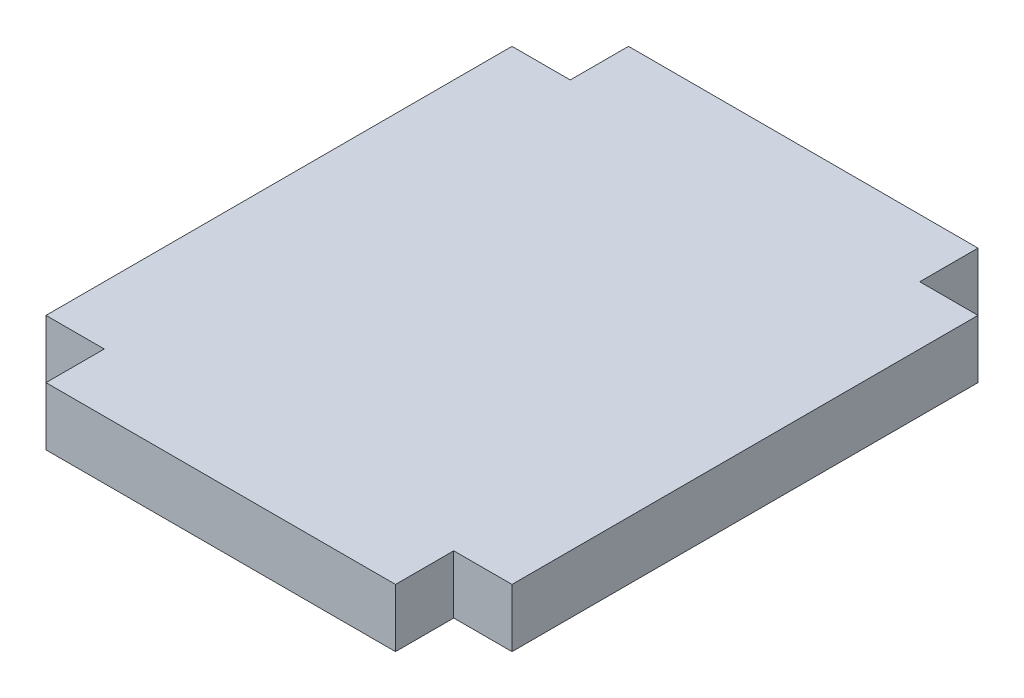
ISO-10303-21;
HEADER;
FILE_DESCRIPTION(('STEP AP214'),'2;1');
FILE_NAME('part.step','',(''),(''),'','','');
FILE_SCHEMA(('AUTOMOTIVE_DESIGN { 1 0 10303 214 1 1 1 1 }'));
ENDSEC;
DATA;
#1=APPLICATION_CONTEXT('core data for automotive mechanical design processes');
#2=APPLICATION_PROTOCOL_DEFINITION('international standard','automotive_design',2000,#1);
#3=PRODUCT_CONTEXT('',#1,'mechanical');
#4=PRODUCT('Part','Part','',(#3));
#5=PRODUCT_RELATED_PRODUCT_CATEGORY('part','',(#4));
#6=PRODUCT_DEFINITION_FORMATION('','',#4);
#7=PRODUCT_DEFINITION_CONTEXT('part definition',#1,'design');
#8=PRODUCT_DEFINITION('design','',#6,#7);
#9=PRODUCT_DEFINITION_SHAPE('','',#8);
#10=(LENGTH_UNIT() NAMED_UNIT(*) SI_UNIT(.MILLI.,.METRE.));
#11=(NAMED_UNIT(*) PLANE_ANGLE_UNIT() SI_UNIT($,.RADIAN.));
#12=(NAMED_UNIT(*) SI_UNIT($,.STERADIAN.) SOLID_ANGLE_UNIT());
#13=UNCERTAINTY_MEASURE_WITH_UNIT(LENGTH_MEASURE(1.E-05),#10,'distance_accuracy_value','');
#14=(GEOMETRIC_REPRESENTATION_CONTEXT(3) GLOBAL_UNCERTAINTY_ASSIGNED_CONTEXT((#13)) GLOBAL_UNIT_ASSIGNED_CONTEXT((#10,
#11,#12)) REPRESENTATION_CONTEXT('',''));
#15=CARTESIAN_POINT('',(0.,0.,0.));
#16=DIRECTION('',(0.,0.,1.));
#17=DIRECTION('',(1.,0.,0.));
#18=AXIS2_PLACEMENT_3D('',#15,#16,#17);
#19=CARTESIAN_POINT('',(0.,3.,-3.));
#20=DIRECTION('',(0.,0.,1.));
#21=DIRECTION('',(1.,0.,0.));
#22=AXIS2_PLACEMENT_3D('',#19,#20,#21);
#23=PLANE('',#22);
#24=DIRECTION('',(-1.,0.,0.));
#25=VECTOR('',#24,1.);
#26=CARTESIAN_POINT('',(0.,0.,-3.));
#27=LINE('',#26,#25);
#28=CARTESIAN_POINT('',(0.,0.,-3.));
#29=VERTEX_POINT('',#28);
#30=CARTESIAN_POINT('',(-3.,0.,-3.));
#31=VERTEX_POINT('',#30);
#32=EDGE_CURVE('E148',#29,#31,#27,.T.);
#33=ORIENTED_EDGE('',*,*,#32,.F.);
#34=DIRECTION('',(0.,-1.,0.));
#35=VECTOR('',#34,1.);
#36=CARTESIAN_POINT('',(0.,3.,-3.));
#37=LINE('',#36,#35);
#38=CARTESIAN_POINT('',(0.,3.,-3.));
#39=VERTEX_POINT('',#38);
#40=EDGE_CURVE('E11',#39,#29,#37,.T.);
#41=ORIENTED_EDGE('',*,*,#40,.F.);
#42=DIRECTION('',(-1.,0.,0.));
#43=VECTOR('',#42,1.);
#44=CARTESIAN_POINT('',(0.,3.,-3.));
#45=LINE('',#44,#43);
#46=CARTESIAN_POINT('',(-3.,3.,-3.));
#47=VERTEX_POINT('',#46);
#48=EDGE_CURVE('E176',#39,#47,#45,.T.);
#49=ORIENTED_EDGE('',*,*,#48,.T.);
#50=DIRECTION('',(0.,-1.,0.));
#51=VECTOR('',#50,1.);
#52=CARTESIAN_POINT('',(-3.,3.,-3.));
#53=LINE('',#52,#51);
#54=EDGE_CURVE('E48',#47,#31,#53,.T.);
#55=ORIENTED_EDGE('',*,*,#54,.T.);
#56=EDGE_LOOP('',(#33,#41,#49,#55));
#57=FACE_BOUND('',#56,.T.);
#58=ADVANCED_FACE('F32',(#57),#23,.T.);
#59=CARTESIAN_POINT('',(0.,3.,0.));
#60=DIRECTION('',(-1.,0.,0.));
#61=DIRECTION('',(0.,0.,1.));
#62=AXIS2_PLACEMENT_3D('',#59,#60,#61);
#63=PLANE('',#62);
#64=DIRECTION('',(0.,0.,-1.));
#65=VECTOR('',#64,1.);
#66=CARTESIAN_POINT('',(0.,0.,0.));
#67=LINE('',#66,#65);
#68=CARTESIAN_POINT('',(0.,0.,0.));
#69=VERTEX_POINT('',#68);
#70=EDGE_CURVE('E150',#69,#29,#67,.T.);
#71=ORIENTED_EDGE('',*,*,#70,.F.);
#72=DIRECTION('',(0.,-1.,0.));
#73=VECTOR('',#72,1.);
#74=CARTESIAN_POINT('',(0.,3.,0.));
#75=LINE('',#74,#73);
#76=CARTESIAN_POINT('',(0.,3.,0.));
#77=VERTEX_POINT('',#76);
#78=EDGE_CURVE('E40',#77,#69,#75,.T.);
#79=ORIENTED_EDGE('',*,*,#78,.F.);
#80=DIRECTION('',(0.,0.,-1.));
#81=VECTOR('',#80,1.);
#82=CARTESIAN_POINT('',(0.,3.,0.));
#83=LINE('',#82,#81);
#84=EDGE_CURVE('E209',#77,#39,#83,.T.);
#85=ORIENTED_EDGE('',*,*,#84,.T.);
#86=ORIENTED_EDGE('',*,*,#40,.T.);
#87=EDGE_LOOP('',(#71,#79,#85,#86));
#88=FACE_BOUND('',#87,.T.);
#89=ADVANCED_FACE('F208',(#88),#63,.T.);
#90=CARTESIAN_POINT('',(0.,3.,0.));
#91=DIRECTION('',(0.,0.,-1.));
#92=DIRECTION('',(-1.,0.,0.));
#93=AXIS2_PLACEMENT_3D('',#90,#91,#92);
#94=PLANE('',#93);
#95=DIRECTION('',(1.,0.,0.));
#96=VECTOR('',#95,1.);
#97=CARTESIAN_POINT('',(0.,0.,0.));
#98=LINE('',#97,#96);
#99=CARTESIAN_POINT('',(18.,0.,0.));
#100=VERTEX_POINT('',#99);
#101=EDGE_CURVE('E153',#69,#100,#98,.T.);
#102=ORIENTED_EDGE('',*,*,#101,.T.);
#103=DIRECTION('',(0.,-1.,0.));
#104=VECTOR('',#103,1.);
#105=CARTESIAN_POINT('',(18.,3.,0.));
#106=LINE('',#105,#104);
#107=CARTESIAN_POINT('',(18.,3.,0.));
#108=VERTEX_POINT('',#107);
#109=EDGE_CURVE('E193',#108,#100,#106,.T.);
#110=ORIENTED_EDGE('',*,*,#109,.F.);
#111=DIRECTION('',(1.,0.,0.));
#112=VECTOR('',#111,1.);
#113=CARTESIAN_POINT('',(0.,3.,0.));
#114=LINE('',#113,#112);
#115=EDGE_CURVE('E200',#77,#108,#114,.T.);
#116=ORIENTED_EDGE('',*,*,#115,.F.);
#117=ORIENTED_EDGE('',*,*,#78,.T.);
#118=EDGE_LOOP('',(#102,#110,#116,#117));
#119=FACE_BOUND('',#118,.T.);
#120=ADVANCED_FACE('F198',(#119),#94,.F.);
#121=CARTESIAN_POINT('',(18.,3.,0.));
#122=DIRECTION('',(-1.,0.,0.));
#123=DIRECTION('',(0.,0.,1.));
#124=AXIS2_PLACEMENT_3D('',#121,#122,#123);
#125=PLANE('',#124);
#126=DIRECTION('',(0.,0.,-1.));
#127=VECTOR('',#126,1.);
#128=CARTESIAN_POINT('',(18.,0.,0.));
#129=LINE('',#128,#127);
#130=CARTESIAN_POINT('',(18.,0.,-3.));
#131=VERTEX_POINT('',#130);
#132=EDGE_CURVE('E155',#100,#131,#129,.T.);
#133=ORIENTED_EDGE('',*,*,#132,.T.);
#134=DIRECTION('',(0.,-1.,0.));
#135=VECTOR('',#134,1.);
#136=CARTESIAN_POINT('',(18.,3.,-3.));
#137=LINE('',#136,#135);
#138=CARTESIAN_POINT('',(18.,3.,-3.));
#139=VERTEX_POINT('',#138);
#140=EDGE_CURVE('E191',#139,#131,#137,.T.);
#141=ORIENTED_EDGE('',*,*,#140,.F.);
#142=DIRECTION('',(0.,0.,-1.));
#143=VECTOR('',#142,1.);
#144=CARTESIAN_POINT('',(18.,3.,0.));
#145=LINE('',#144,#143);
#146=EDGE_CURVE('E352',#108,#139,#145,.T.);
#147=ORIENTED_EDGE('',*,*,#146,.F.);
#148=ORIENTED_EDGE('',*,*,#109,.T.);
#149=EDGE_LOOP('',(#133,#141,#147,#148));
#150=FACE_BOUND('',#149,.T.);
#151=ADVANCED_FACE('F227',(#150),#125,.F.);
#152=CARTESIAN_POINT('',(0.,3.,-3.));
#153=DIRECTION('',(0.,0.,1.));
#154=DIRECTION('',(1.,0.,0.));
#155=AXIS2_PLACEMENT_3D('',#152,#153,#154);
#156=PLANE('',#155);
#157=DIRECTION('',(-1.,0.,0.));
#158=VECTOR('',#157,1.);
#159=CARTESIAN_POINT('',(0.,0.,-3.));
#160=LINE('',#159,#158);
#161=CARTESIAN_POINT('',(21.,0.,-3.));
#162=VERTEX_POINT('',#161);
#163=EDGE_CURVE('E158',#162,#131,#160,.T.);
#164=ORIENTED_EDGE('',*,*,#163,.F.);
#165=DIRECTION('',(0.,-1.,0.));
#166=VECTOR('',#165,1.);
#167=CARTESIAN_POINT('',(21.,3.,-3.));
#168=LINE('',#167,#166);
#169=CARTESIAN_POINT('',(21.,3.,-3.));
#170=VERTEX_POINT('',#169);
#171=EDGE_CURVE('E189',#170,#162,#168,.T.);
#172=ORIENTED_EDGE('',*,*,#171,.F.);
#173=DIRECTION('',(-1.,0.,0.));
#174=VECTOR('',#173,1.);
#175=CARTESIAN_POINT('',(0.,3.,-3.));
#176=LINE('',#175,#174);
#177=EDGE_CURVE('E350',#170,#139,#176,.T.);
#178=ORIENTED_EDGE('',*,*,#177,.T.);
#179=ORIENTED_EDGE('',*,*,#140,.T.);
#180=EDGE_LOOP('',(#164,#172,#178,#179));
#181=FACE_BOUND('',#180,.T.);
#182=ADVANCED_FACE('F232',(#181),#156,.T.);
#183=CARTESIAN_POINT('',(21.,3.,0.));
#184=DIRECTION('',(-1.,0.,0.));
#185=DIRECTION('',(0.,0.,1.));
#186=AXIS2_PLACEMENT_3D('',#183,#184,#185);
#187=PLANE('',#186);
#188=DIRECTION('',(0.,0.,-1.));
#189=VECTOR('',#188,1.);
#190=CARTESIAN_POINT('',(21.,0.,0.));
#191=LINE('',#190,#189);
#192=CARTESIAN_POINT('',(21.,0.,-27.));
#193=VERTEX_POINT('',#192);
#194=EDGE_CURVE('E161',#162,#193,#191,.T.);
#195=ORIENTED_EDGE('',*,*,#194,.T.);
#196=DIRECTION('',(0.,-1.,0.));
#197=VECTOR('',#196,1.);
#198=CARTESIAN_POINT('',(21.,3.,-27.));
#199=LINE('',#198,#197);
#200=CARTESIAN_POINT('',(21.,3.,-27.));
#201=VERTEX_POINT('',#200);
#202=EDGE_CURVE('E186',#201,#193,#199,.T.);
#203=ORIENTED_EDGE('',*,*,#202,.F.);
#204=DIRECTION('',(0.,0.,-1.));
#205=VECTOR('',#204,1.);
#206=CARTESIAN_POINT('',(21.,3.,0.));
#207=LINE('',#206,#205);
#208=EDGE_CURVE('E345',#170,#201,#207,.T.);
#209=ORIENTED_EDGE('',*,*,#208,.F.);
#210=ORIENTED_EDGE('',*,*,#171,.T.);
#211=EDGE_LOOP('',(#195,#203,#209,#210));
#212=FACE_BOUND('',#211,.T.);
#213=ADVANCED_FACE('F236',(#212),#187,.F.);
#214=CARTESIAN_POINT('',(0.,3.,-27.));
#215=DIRECTION('',(0.,0.,1.));
#216=DIRECTION('',(1.,0.,0.));
#217=AXIS2_PLACEMENT_3D('',#214,#215,#216);
#218=PLANE('',#217);
#219=DIRECTION('',(-1.,0.,0.));
#220=VECTOR('',#219,1.);
#221=CARTESIAN_POINT('',(0.,0.,-27.));
#222=LINE('',#221,#220);
#223=CARTESIAN_POINT('',(18.,0.,-27.));
#224=VERTEX_POINT('',#223);
#225=EDGE_CURVE('E163',#193,#224,#222,.T.);
#226=ORIENTED_EDGE('',*,*,#225,.T.);
#227=DIRECTION('',(0.,-1.,0.));
#228=VECTOR('',#227,1.);
#229=CARTESIAN_POINT('',(18.,3.,-27.));
#230=LINE('',#229,#228);
#231=CARTESIAN_POINT('',(18.,3.,-27.));
#232=VERTEX_POINT('',#231);
#233=EDGE_CURVE('E183',#232,#224,#230,.T.);
#234=ORIENTED_EDGE('',*,*,#233,.F.);
#235=DIRECTION('',(-1.,0.,0.));
#236=VECTOR('',#235,1.);
#237=CARTESIAN_POINT('',(0.,3.,-27.));
#238=LINE('',#237,#236);
#239=EDGE_CURVE('E342',#201,#232,#238,.T.);
#240=ORIENTED_EDGE('',*,*,#239,.F.);
#241=ORIENTED_EDGE('',*,*,#202,.T.);
#242=EDGE_LOOP('',(#226,#234,#240,#241));
#243=FACE_BOUND('',#242,.T.);
#244=ADVANCED_FACE('F240',(#243),#218,.F.);
#245=CARTESIAN_POINT('',(18.,3.,0.));
#246=DIRECTION('',(-1.,0.,0.));
#247=DIRECTION('',(0.,0.,1.));
#248=AXIS2_PLACEMENT_3D('',#245,#246,#247);
#249=PLANE('',#248);
#250=DIRECTION('',(0.,0.,-1.));
#251=VECTOR('',#250,1.);
#252=CARTESIAN_POINT('',(18.,0.,0.));
#253=LINE('',#252,#251);
#254=CARTESIAN_POINT('',(18.,0.,-30.));
#255=VERTEX_POINT('',#254);
#256=EDGE_CURVE('E165',#224,#255,#253,.T.);
#257=ORIENTED_EDGE('',*,*,#256,.T.);
#258=DIRECTION('',(0.,-1.,0.));
#259=VECTOR('',#258,1.);
#260=CARTESIAN_POINT('',(18.,3.,-30.));
#261=LINE('',#260,#259);
#262=CARTESIAN_POINT('',(18.,3.,-30.));
#263=VERTEX_POINT('',#262);
#264=EDGE_CURVE('E180',#263,#255,#261,.T.);
#265=ORIENTED_EDGE('',*,*,#264,.F.);
#266=DIRECTION('',(0.,0.,-1.));
#267=VECTOR('',#266,1.);
#268=CARTESIAN_POINT('',(18.,3.,0.));
#269=LINE('',#268,#267);
#270=EDGE_CURVE('E340',#232,#263,#269,.T.);
#271=ORIENTED_EDGE('',*,*,#270,.F.);
#272=ORIENTED_EDGE('',*,*,#233,.T.);
#273=EDGE_LOOP('',(#257,#265,#271,#272));
#274=FACE_BOUND('',#273,.T.);
#275=ADVANCED_FACE('F244',(#274),#249,.F.);
#276=CARTESIAN_POINT('',(0.,3.,-30.));
#277=DIRECTION('',(0.,0.,1.));
#278=DIRECTION('',(1.,0.,0.));
#279=AXIS2_PLACEMENT_3D('',#276,#277,#278);
#280=PLANE('',#279);
#281=DIRECTION('',(-1.,0.,0.));
#282=VECTOR('',#281,1.);
#283=CARTESIAN_POINT('',(0.,0.,-30.));
#284=LINE('',#283,#282);
#285=CARTESIAN_POINT('',(0.,0.,-30.));
#286=VERTEX_POINT('',#285);
#287=EDGE_CURVE('E167',#255,#286,#284,.T.);
#288=ORIENTED_EDGE('',*,*,#287,.T.);
#289=DIRECTION('',(0.,-1.,0.));
#290=VECTOR('',#289,1.);
#291=CARTESIAN_POINT('',(0.,3.,-30.));
#292=LINE('',#291,#290);
#293=CARTESIAN_POINT('',(0.,3.,-30.));
#294=VERTEX_POINT('',#293);
#295=EDGE_CURVE('E131',#294,#286,#292,.T.);
#296=ORIENTED_EDGE('',*,*,#295,.F.);
#297=DIRECTION('',(-1.,0.,0.));
#298=VECTOR('',#297,1.);
#299=CARTESIAN_POINT('',(0.,3.,-30.));
#300=LINE('',#299,#298);
#301=EDGE_CURVE('E139',#263,#294,#300,.T.);
#302=ORIENTED_EDGE('',*,*,#301,.F.);
#303=ORIENTED_EDGE('',*,*,#264,.T.);
#304=EDGE_LOOP('',(#288,#296,#302,#303));
#305=FACE_BOUND('',#304,.T.);
#306=ADVANCED_FACE('F248',(#305),#280,.F.);
#307=CARTESIAN_POINT('',(0.,3.,0.));
#308=DIRECTION('',(-1.,0.,0.));
#309=DIRECTION('',(0.,0.,1.));
#310=AXIS2_PLACEMENT_3D('',#307,#308,#309);
#311=PLANE('',#310);
#312=DIRECTION('',(0.,0.,-1.));
#313=VECTOR('',#312,1.);
#314=CARTESIAN_POINT('',(0.,0.,0.));
#315=LINE('',#314,#313);
#316=CARTESIAN_POINT('',(0.,0.,-27.));
#317=VERTEX_POINT('',#316);
#318=EDGE_CURVE('E127',#317,#286,#315,.T.);
#319=ORIENTED_EDGE('',*,*,#318,.F.);
#320=DIRECTION('',(0.,-1.,0.));
#321=VECTOR('',#320,1.);
#322=CARTESIAN_POINT('',(0.,3.,-27.));
#323=LINE('',#322,#321);
#324=CARTESIAN_POINT('',(0.,3.,-27.));
#325=VERTEX_POINT('',#324);
#326=EDGE_CURVE('E122',#325,#317,#323,.T.);
#327=ORIENTED_EDGE('',*,*,#326,.F.);
#328=DIRECTION('',(0.,0.,-1.));
#329=VECTOR('',#328,1.);
#330=CARTESIAN_POINT('',(0.,3.,0.));
#331=LINE('',#330,#329);
#332=EDGE_CURVE('E125',#325,#294,#331,.T.);
#333=ORIENTED_EDGE('',*,*,#332,.T.);
#334=ORIENTED_EDGE('',*,*,#295,.T.);
#335=EDGE_LOOP('',(#319,#327,#333,#334));
#336=FACE_BOUND('',#335,.T.);
#337=ADVANCED_FACE('F124',(#336),#311,.T.);
#338=CARTESIAN_POINT('',(0.,3.,-27.));
#339=DIRECTION('',(0.,0.,-1.));
#340=DIRECTION('',(-1.,0.,0.));
#341=AXIS2_PLACEMENT_3D('',#338,#339,#340);
#342=PLANE('',#341);
#343=DIRECTION('',(1.,0.,0.));
#344=VECTOR('',#343,1.);
#345=CARTESIAN_POINT('',(0.,0.,-27.));
#346=LINE('',#345,#344);
#347=CARTESIAN_POINT('',(-3.,0.,-27.));
#348=VERTEX_POINT('',#347);
#349=EDGE_CURVE('E171',#348,#317,#346,.T.);
#350=ORIENTED_EDGE('',*,*,#349,.F.);
#351=DIRECTION('',(0.,-1.,0.));
#352=VECTOR('',#351,1.);
#353=CARTESIAN_POINT('',(-3.,3.,-27.));
#354=LINE('',#353,#352);
#355=CARTESIAN_POINT('',(-3.,3.,-27.));
#356=VERTEX_POINT('',#355);
#357=EDGE_CURVE('E85',#356,#348,#354,.T.);
#358=ORIENTED_EDGE('',*,*,#357,.F.);
#359=DIRECTION('',(1.,0.,0.));
#360=VECTOR('',#359,1.);
#361=CARTESIAN_POINT('',(0.,3.,-27.));
#362=LINE('',#361,#360);
#363=EDGE_CURVE('E137',#356,#325,#362,.T.);
#364=ORIENTED_EDGE('',*,*,#363,.T.);
#365=ORIENTED_EDGE('',*,*,#326,.T.);
#366=EDGE_LOOP('',(#350,#358,#364,#365));
#367=FACE_BOUND('',#366,.T.);
#368=ADVANCED_FACE('F142',(#367),#342,.T.);
#369=CARTESIAN_POINT('',(-3.,3.,0.));
#370=DIRECTION('',(-1.,0.,0.));
#371=DIRECTION('',(0.,0.,1.));
#372=AXIS2_PLACEMENT_3D('',#369,#370,#371);
#373=PLANE('',#372);
#374=DIRECTION('',(0.,0.,-1.));
#375=VECTOR('',#374,1.);
#376=CARTESIAN_POINT('',(-3.,0.,0.));
#377=LINE('',#376,#375);
#378=EDGE_CURVE('E173',#31,#348,#377,.T.);
#379=ORIENTED_EDGE('',*,*,#378,.F.);
#380=ORIENTED_EDGE('',*,*,#54,.F.);
#381=DIRECTION('',(0.,0.,-1.));
#382=VECTOR('',#381,1.);
#383=CARTESIAN_POINT('',(-3.,3.,0.));
#384=LINE('',#383,#382);
#385=EDGE_CURVE('E143',#47,#356,#384,.T.);
#386=ORIENTED_EDGE('',*,*,#385,.T.);
#387=ORIENTED_EDGE('',*,*,#357,.T.);
#388=EDGE_LOOP('',(#379,#380,#386,#387));
#389=FACE_BOUND('',#388,.T.);
#390=ADVANCED_FACE('F210',(#389),#373,.T.);
#391=CARTESIAN_POINT('',(0.,3.,0.));
#392=DIRECTION('',(0.,1.,0.));
#393=DIRECTION('',(0.,0.,1.));
#394=AXIS2_PLACEMENT_3D('',#391,#392,#393);
#395=PLANE('',#394);
#396=ORIENTED_EDGE('',*,*,#48,.F.);
#397=ORIENTED_EDGE('',*,*,#84,.F.);
#398=ORIENTED_EDGE('',*,*,#115,.T.);
#399=ORIENTED_EDGE('',*,*,#146,.T.);
#400=ORIENTED_EDGE('',*,*,#177,.F.);
#401=ORIENTED_EDGE('',*,*,#208,.T.);
#402=ORIENTED_EDGE('',*,*,#239,.T.);
#403=ORIENTED_EDGE('',*,*,#270,.T.);
#404=ORIENTED_EDGE('',*,*,#301,.T.);
#405=ORIENTED_EDGE('',*,*,#332,.F.);
#406=ORIENTED_EDGE('',*,*,#363,.F.);
#407=ORIENTED_EDGE('',*,*,#385,.F.);
#408=EDGE_LOOP('',(#396,#397,#398,#399,#400,#401,#402,#403,#404,#405,#406,#407));
#409=FACE_BOUND('',#408,.T.);
#410=ADVANCED_FACE('F135',(#409),#395,.T.);
#411=CARTESIAN_POINT('',(0.,0.,0.));
#412=DIRECTION('',(0.,1.,0.));
#413=DIRECTION('',(0.,0.,1.));
#414=AXIS2_PLACEMENT_3D('',#411,#412,#413);
#415=PLANE('',#414);
#416=ORIENTED_EDGE('',*,*,#32,.T.);
#417=ORIENTED_EDGE('',*,*,#378,.T.);
#418=ORIENTED_EDGE('',*,*,#349,.T.);
#419=ORIENTED_EDGE('',*,*,#318,.T.);
#420=ORIENTED_EDGE('',*,*,#287,.F.);
#421=ORIENTED_EDGE('',*,*,#256,.F.);
#422=ORIENTED_EDGE('',*,*,#225,.F.);
#423=ORIENTED_EDGE('',*,*,#194,.F.);
#424=ORIENTED_EDGE('',*,*,#163,.T.);
#425=ORIENTED_EDGE('',*,*,#132,.F.);
#426=ORIENTED_EDGE('',*,*,#101,.F.);
#427=ORIENTED_EDGE('',*,*,#70,.T.);
#428=EDGE_LOOP('',(#416,#417,#418,#419,#420,#421,#422,#423,#424,#425,#426,#427));
#429=FACE_BOUND('',#428,.T.);
#430=ADVANCED_FACE('F207',(#429),#415,.F.);
#431=CLOSED_SHELL('',(#58,#89,#120,#151,#182,#213,#244,#275,#306,#337,#368,#390,#410,#430));
#432=MANIFOLD_SOLID_BREP('B2',#431);
#433=ADVANCED_BREP_SHAPE_REPRESENTATION('',(#18,#432),#14);
#434=SHAPE_DEFINITION_REPRESENTATION(#9,#433);
ENDSEC;
END-ISO-10303-21;
